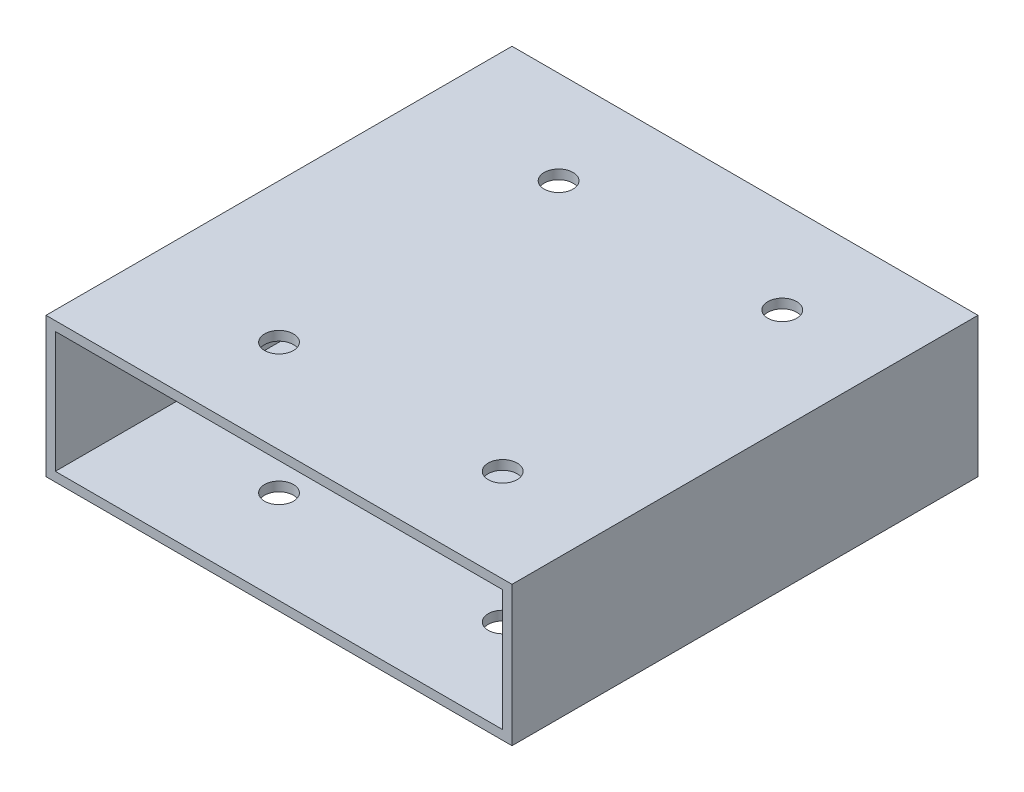
ISO-10303-21;
HEADER;
FILE_DESCRIPTION(('STEP AP214'),'2;1');
FILE_NAME('part.step','',(''),(''),'','','');
FILE_SCHEMA(('AUTOMOTIVE_DESIGN { 1 0 10303 214 1 1 1 1 }'));
ENDSEC;
DATA;
#1=APPLICATION_CONTEXT('core data for automotive mechanical design processes');
#2=APPLICATION_PROTOCOL_DEFINITION('international standard','automotive_design',2000,#1);
#3=PRODUCT_CONTEXT('',#1,'mechanical');
#4=PRODUCT('Part','Part','',(#3));
#5=PRODUCT_RELATED_PRODUCT_CATEGORY('part','',(#4));
#6=PRODUCT_DEFINITION_FORMATION('','',#4);
#7=PRODUCT_DEFINITION_CONTEXT('part definition',#1,'design');
#8=PRODUCT_DEFINITION('design','',#6,#7);
#9=PRODUCT_DEFINITION_SHAPE('','',#8);
#10=(LENGTH_UNIT() NAMED_UNIT(*) SI_UNIT(.MILLI.,.METRE.));
#11=(NAMED_UNIT(*) PLANE_ANGLE_UNIT() SI_UNIT($,.RADIAN.));
#12=(NAMED_UNIT(*) SI_UNIT($,.STERADIAN.) SOLID_ANGLE_UNIT());
#13=UNCERTAINTY_MEASURE_WITH_UNIT(LENGTH_MEASURE(1.E-05),#10,'distance_accuracy_value','');
#14=(GEOMETRIC_REPRESENTATION_CONTEXT(3) GLOBAL_UNCERTAINTY_ASSIGNED_CONTEXT((#13)) GLOBAL_UNIT_ASSIGNED_CONTEXT((#10,
#11,#12)) REPRESENTATION_CONTEXT('',''));
#15=CARTESIAN_POINT('',(0.,0.,0.));
#16=DIRECTION('',(0.,0.,1.));
#17=DIRECTION('',(1.,0.,0.));
#18=AXIS2_PLACEMENT_3D('',#15,#16,#17);
#19=CARTESIAN_POINT('',(0.,0.,50.));
#20=DIRECTION('',(0.,0.,-1.));
#21=DIRECTION('',(-1.,0.,0.));
#22=AXIS2_PLACEMENT_3D('',#19,#20,#21);
#23=PLANE('',#22);
#24=DIRECTION('',(0.,-1.,0.));
#25=VECTOR('',#24,1.);
#26=CARTESIAN_POINT('',(0.,0.,50.));
#27=LINE('',#26,#25);
#28=CARTESIAN_POINT('',(0.,15.,50.));
#29=VERTEX_POINT('',#28);
#30=CARTESIAN_POINT('',(0.,0.,50.));
#31=VERTEX_POINT('',#30);
#32=EDGE_CURVE('E159',#29,#31,#27,.T.);
#33=ORIENTED_EDGE('',*,*,#32,.T.);
#34=DIRECTION('',(1.,0.,0.));
#35=VECTOR('',#34,1.);
#36=CARTESIAN_POINT('',(0.,0.,50.));
#37=LINE('',#36,#35);
#38=CARTESIAN_POINT('',(50.,0.,50.));
#39=VERTEX_POINT('',#38);
#40=EDGE_CURVE('E163',#31,#39,#37,.T.);
#41=ORIENTED_EDGE('',*,*,#40,.T.);
#42=DIRECTION('',(0.,1.,0.));
#43=VECTOR('',#42,1.);
#44=CARTESIAN_POINT('',(50.,0.,50.));
#45=LINE('',#44,#43);
#46=CARTESIAN_POINT('',(50.,15.,50.));
#47=VERTEX_POINT('',#46);
#48=EDGE_CURVE('E167',#39,#47,#45,.T.);
#49=ORIENTED_EDGE('',*,*,#48,.T.);
#50=DIRECTION('',(-1.,0.,0.));
#51=VECTOR('',#50,1.);
#52=CARTESIAN_POINT('',(0.,15.,50.));
#53=LINE('',#52,#51);
#54=EDGE_CURVE('E170',#47,#29,#53,.T.);
#55=ORIENTED_EDGE('',*,*,#54,.T.);
#56=EDGE_LOOP('',(#33,#41,#49,#55));
#57=FACE_BOUND('',#56,.T.);
#58=DIRECTION('',(0.,-1.,0.));
#59=VECTOR('',#58,1.);
#60=CARTESIAN_POINT('',(1.,1.,50.));
#61=LINE('',#60,#59);
#62=CARTESIAN_POINT('',(1.,14.,50.));
#63=VERTEX_POINT('',#62);
#64=CARTESIAN_POINT('',(1.,1.,50.));
#65=VERTEX_POINT('',#64);
#66=EDGE_CURVE('E107',#63,#65,#61,.T.);
#67=ORIENTED_EDGE('',*,*,#66,.F.);
#68=DIRECTION('',(-1.,0.,0.));
#69=VECTOR('',#68,1.);
#70=CARTESIAN_POINT('',(1.,14.,50.));
#71=LINE('',#70,#69);
#72=CARTESIAN_POINT('',(49.,14.,50.));
#73=VERTEX_POINT('',#72);
#74=EDGE_CURVE('E135',#73,#63,#71,.T.);
#75=ORIENTED_EDGE('',*,*,#74,.F.);
#76=DIRECTION('',(0.,1.,0.));
#77=VECTOR('',#76,1.);
#78=CARTESIAN_POINT('',(49.,1.,50.));
#79=LINE('',#78,#77);
#80=CARTESIAN_POINT('',(49.,1.,50.));
#81=VERTEX_POINT('',#80);
#82=EDGE_CURVE('E129',#81,#73,#79,.T.);
#83=ORIENTED_EDGE('',*,*,#82,.F.);
#84=DIRECTION('',(1.,0.,0.));
#85=VECTOR('',#84,1.);
#86=CARTESIAN_POINT('',(1.,1.,50.));
#87=LINE('',#86,#85);
#88=EDGE_CURVE('E116',#65,#81,#87,.T.);
#89=ORIENTED_EDGE('',*,*,#88,.F.);
#90=EDGE_LOOP('',(#67,#75,#83,#89));
#91=FACE_BOUND('',#90,.T.);
#92=ADVANCED_FACE('F39',(#57,#91),#23,.F.);
#93=CARTESIAN_POINT('',(0.,0.,0.));
#94=DIRECTION('',(0.,0.,-1.));
#95=DIRECTION('',(-1.,0.,0.));
#96=AXIS2_PLACEMENT_3D('',#93,#94,#95);
#97=PLANE('',#96);
#98=DIRECTION('',(0.,-1.,0.));
#99=VECTOR('',#98,1.);
#100=CARTESIAN_POINT('',(0.,0.,0.));
#101=LINE('',#100,#99);
#102=CARTESIAN_POINT('',(0.,15.,0.));
#103=VERTEX_POINT('',#102);
#104=CARTESIAN_POINT('',(0.,0.,0.));
#105=VERTEX_POINT('',#104);
#106=EDGE_CURVE('E125',#103,#105,#101,.T.);
#107=ORIENTED_EDGE('',*,*,#106,.F.);
#108=DIRECTION('',(-1.,0.,0.));
#109=VECTOR('',#108,1.);
#110=CARTESIAN_POINT('',(0.,15.,0.));
#111=LINE('',#110,#109);
#112=CARTESIAN_POINT('',(50.,15.,0.));
#113=VERTEX_POINT('',#112);
#114=EDGE_CURVE('E164',#113,#103,#111,.T.);
#115=ORIENTED_EDGE('',*,*,#114,.F.);
#116=DIRECTION('',(0.,1.,0.));
#117=VECTOR('',#116,1.);
#118=CARTESIAN_POINT('',(50.,0.,0.));
#119=LINE('',#118,#117);
#120=CARTESIAN_POINT('',(50.,0.,0.));
#121=VERTEX_POINT('',#120);
#122=EDGE_CURVE('E180',#121,#113,#119,.T.);
#123=ORIENTED_EDGE('',*,*,#122,.F.);
#124=DIRECTION('',(1.,0.,0.));
#125=VECTOR('',#124,1.);
#126=CARTESIAN_POINT('',(0.,0.,0.));
#127=LINE('',#126,#125);
#128=EDGE_CURVE('E177',#105,#121,#127,.T.);
#129=ORIENTED_EDGE('',*,*,#128,.F.);
#130=EDGE_LOOP('',(#107,#115,#123,#129));
#131=FACE_BOUND('',#130,.T.);
#132=DIRECTION('',(-1.,0.,0.));
#133=VECTOR('',#132,1.);
#134=CARTESIAN_POINT('',(1.,14.,0.));
#135=LINE('',#134,#133);
#136=CARTESIAN_POINT('',(49.,14.,0.));
#137=VERTEX_POINT('',#136);
#138=CARTESIAN_POINT('',(1.,14.,0.));
#139=VERTEX_POINT('',#138);
#140=EDGE_CURVE('E117',#137,#139,#135,.T.);
#141=ORIENTED_EDGE('',*,*,#140,.T.);
#142=DIRECTION('',(0.,-1.,0.));
#143=VECTOR('',#142,1.);
#144=CARTESIAN_POINT('',(1.,1.,0.));
#145=LINE('',#144,#143);
#146=CARTESIAN_POINT('',(1.,1.,0.));
#147=VERTEX_POINT('',#146);
#148=EDGE_CURVE('E65',#139,#147,#145,.T.);
#149=ORIENTED_EDGE('',*,*,#148,.T.);
#150=DIRECTION('',(1.,0.,0.));
#151=VECTOR('',#150,1.);
#152=CARTESIAN_POINT('',(1.,1.,0.));
#153=LINE('',#152,#151);
#154=CARTESIAN_POINT('',(49.,1.,0.));
#155=VERTEX_POINT('',#154);
#156=EDGE_CURVE('E123',#147,#155,#153,.T.);
#157=ORIENTED_EDGE('',*,*,#156,.T.);
#158=DIRECTION('',(0.,1.,0.));
#159=VECTOR('',#158,1.);
#160=CARTESIAN_POINT('',(49.,1.,0.));
#161=LINE('',#160,#159);
#162=EDGE_CURVE('E146',#155,#137,#161,.T.);
#163=ORIENTED_EDGE('',*,*,#162,.T.);
#164=EDGE_LOOP('',(#141,#149,#157,#163));
#165=FACE_BOUND('',#164,.T.);
#166=ADVANCED_FACE('F244',(#131,#165),#97,.T.);
#167=CARTESIAN_POINT('',(0.,0.,50.));
#168=DIRECTION('',(1.,0.,0.));
#169=DIRECTION('',(0.,0.,-1.));
#170=AXIS2_PLACEMENT_3D('',#167,#168,#169);
#171=PLANE('',#170);
#172=ORIENTED_EDGE('',*,*,#106,.T.);
#173=DIRECTION('',(0.,0.,-1.));
#174=VECTOR('',#173,1.);
#175=CARTESIAN_POINT('',(0.,0.,50.));
#176=LINE('',#175,#174);
#177=EDGE_CURVE('E11',#31,#105,#176,.T.);
#178=ORIENTED_EDGE('',*,*,#177,.F.);
#179=ORIENTED_EDGE('',*,*,#32,.F.);
#180=DIRECTION('',(0.,0.,-1.));
#181=VECTOR('',#180,1.);
#182=CARTESIAN_POINT('',(0.,15.,50.));
#183=LINE('',#182,#181);
#184=EDGE_CURVE('E173',#29,#103,#183,.T.);
#185=ORIENTED_EDGE('',*,*,#184,.T.);
#186=EDGE_LOOP('',(#172,#178,#179,#185));
#187=FACE_BOUND('',#186,.T.);
#188=ADVANCED_FACE('F41',(#187),#171,.F.);
#189=CARTESIAN_POINT('',(0.,0.,50.));
#190=DIRECTION('',(0.,1.,0.));
#191=DIRECTION('',(0.,0.,1.));
#192=AXIS2_PLACEMENT_3D('',#189,#190,#191);
#193=PLANE('',#192);
#194=CARTESIAN_POINT('',(39.000000000002,0.,39.9999999999925));
#195=DIRECTION('',(0.,1.,0.));
#196=DIRECTION('',(0.,0.,1.));
#197=AXIS2_PLACEMENT_3D('',#194,#195,#196);
#198=CIRCLE('',#197,1.55000000000125);
#199=CARTESIAN_POINT('',(39.000000000002,0.,41.5499999999937));
#200=VERTEX_POINT('',#199);
#201=EDGE_CURVE('E280',#200,#200,#198,.T.);
#202=ORIENTED_EDGE('',*,*,#201,.T.);
#203=EDGE_LOOP('',(#202));
#204=FACE_BOUND('',#203,.T.);
#205=CARTESIAN_POINT('',(15.000000000002,0.,39.9999999999925));
#206=DIRECTION('',(0.,1.,0.));
#207=DIRECTION('',(0.,0.,1.));
#208=AXIS2_PLACEMENT_3D('',#205,#206,#207);
#209=CIRCLE('',#208,1.55000000000126);
#210=CARTESIAN_POINT('',(15.000000000002,0.,41.5499999999937));
#211=VERTEX_POINT('',#210);
#212=EDGE_CURVE('E284',#211,#211,#209,.T.);
#213=ORIENTED_EDGE('',*,*,#212,.T.);
#214=EDGE_LOOP('',(#213));
#215=FACE_BOUND('',#214,.T.);
#216=CARTESIAN_POINT('',(15.000000000002,0.,9.99999999999248));
#217=DIRECTION('',(0.,1.,0.));
#218=DIRECTION('',(0.,0.,1.));
#219=AXIS2_PLACEMENT_3D('',#216,#217,#218);
#220=CIRCLE('',#219,1.55000000000126);
#221=CARTESIAN_POINT('',(15.000000000002,0.,11.5499999999937));
#222=VERTEX_POINT('',#221);
#223=EDGE_CURVE('E288',#222,#222,#220,.T.);
#224=ORIENTED_EDGE('',*,*,#223,.T.);
#225=EDGE_LOOP('',(#224));
#226=FACE_BOUND('',#225,.T.);
#227=CARTESIAN_POINT('',(39.000000000002,0.,9.99999999999247));
#228=DIRECTION('',(0.,1.,0.));
#229=DIRECTION('',(0.,0.,1.));
#230=AXIS2_PLACEMENT_3D('',#227,#228,#229);
#231=CIRCLE('',#230,1.55000000000127);
#232=CARTESIAN_POINT('',(39.000000000002,0.,11.5499999999937));
#233=VERTEX_POINT('',#232);
#234=EDGE_CURVE('E199',#233,#233,#231,.T.);
#235=ORIENTED_EDGE('',*,*,#234,.T.);
#236=EDGE_LOOP('',(#235));
#237=FACE_BOUND('',#236,.T.);
#238=ORIENTED_EDGE('',*,*,#128,.T.);
#239=DIRECTION('',(0.,0.,-1.));
#240=VECTOR('',#239,1.);
#241=CARTESIAN_POINT('',(50.,0.,50.));
#242=LINE('',#241,#240);
#243=EDGE_CURVE('E49',#39,#121,#242,.T.);
#244=ORIENTED_EDGE('',*,*,#243,.F.);
#245=ORIENTED_EDGE('',*,*,#40,.F.);
#246=ORIENTED_EDGE('',*,*,#177,.T.);
#247=EDGE_LOOP('',(#238,#244,#245,#246));
#248=FACE_BOUND('',#247,.T.);
#249=ADVANCED_FACE('F269',(#204,#215,#226,#237,#248),#193,.F.);
#250=CARTESIAN_POINT('',(50.,0.,50.));
#251=DIRECTION('',(-1.,0.,0.));
#252=DIRECTION('',(0.,0.,1.));
#253=AXIS2_PLACEMENT_3D('',#250,#251,#252);
#254=PLANE('',#253);
#255=ORIENTED_EDGE('',*,*,#122,.T.);
#256=DIRECTION('',(0.,0.,-1.));
#257=VECTOR('',#256,1.);
#258=CARTESIAN_POINT('',(50.,15.,50.));
#259=LINE('',#258,#257);
#260=EDGE_CURVE('E187',#47,#113,#259,.T.);
#261=ORIENTED_EDGE('',*,*,#260,.F.);
#262=ORIENTED_EDGE('',*,*,#48,.F.);
#263=ORIENTED_EDGE('',*,*,#243,.T.);
#264=EDGE_LOOP('',(#255,#261,#262,#263));
#265=FACE_BOUND('',#264,.T.);
#266=ADVANCED_FACE('F266',(#265),#254,.F.);
#267=CARTESIAN_POINT('',(0.,15.,50.));
#268=DIRECTION('',(0.,-1.,0.));
#269=DIRECTION('',(0.,0.,-1.));
#270=AXIS2_PLACEMENT_3D('',#267,#268,#269);
#271=PLANE('',#270);
#272=CARTESIAN_POINT('',(39.000000000002,15.,39.9999999999925));
#273=DIRECTION('',(0.,1.,0.));
#274=DIRECTION('',(0.,0.,1.));
#275=AXIS2_PLACEMENT_3D('',#272,#273,#274);
#276=CIRCLE('',#275,1.55000000000125);
#277=CARTESIAN_POINT('',(39.000000000002,15.,41.5499999999937));
#278=VERTEX_POINT('',#277);
#279=EDGE_CURVE('E310',#278,#278,#276,.T.);
#280=ORIENTED_EDGE('',*,*,#279,.F.);
#281=EDGE_LOOP('',(#280));
#282=FACE_BOUND('',#281,.T.);
#283=CARTESIAN_POINT('',(15.000000000002,15.,39.9999999999925));
#284=DIRECTION('',(0.,1.,0.));
#285=DIRECTION('',(0.,0.,1.));
#286=AXIS2_PLACEMENT_3D('',#283,#284,#285);
#287=CIRCLE('',#286,1.55000000000126);
#288=CARTESIAN_POINT('',(15.000000000002,15.,41.5499999999937));
#289=VERTEX_POINT('',#288);
#290=EDGE_CURVE('E314',#289,#289,#287,.T.);
#291=ORIENTED_EDGE('',*,*,#290,.F.);
#292=EDGE_LOOP('',(#291));
#293=FACE_BOUND('',#292,.T.);
#294=CARTESIAN_POINT('',(15.000000000002,15.,9.99999999999248));
#295=DIRECTION('',(0.,1.,0.));
#296=DIRECTION('',(0.,0.,1.));
#297=AXIS2_PLACEMENT_3D('',#294,#295,#296);
#298=CIRCLE('',#297,1.55000000000126);
#299=CARTESIAN_POINT('',(15.000000000002,15.,11.5499999999937));
#300=VERTEX_POINT('',#299);
#301=EDGE_CURVE('E320',#300,#300,#298,.T.);
#302=ORIENTED_EDGE('',*,*,#301,.F.);
#303=EDGE_LOOP('',(#302));
#304=FACE_BOUND('',#303,.T.);
#305=CARTESIAN_POINT('',(39.000000000002,15.,9.99999999999247));
#306=DIRECTION('',(0.,1.,0.));
#307=DIRECTION('',(0.,0.,1.));
#308=AXIS2_PLACEMENT_3D('',#305,#306,#307);
#309=CIRCLE('',#308,1.55000000000127);
#310=CARTESIAN_POINT('',(39.000000000002,15.,11.5499999999937));
#311=VERTEX_POINT('',#310);
#312=EDGE_CURVE('E305',#311,#311,#309,.T.);
#313=ORIENTED_EDGE('',*,*,#312,.F.);
#314=EDGE_LOOP('',(#313));
#315=FACE_BOUND('',#314,.T.);
#316=ORIENTED_EDGE('',*,*,#114,.T.);
#317=ORIENTED_EDGE('',*,*,#184,.F.);
#318=ORIENTED_EDGE('',*,*,#54,.F.);
#319=ORIENTED_EDGE('',*,*,#260,.T.);
#320=EDGE_LOOP('',(#316,#317,#318,#319));
#321=FACE_BOUND('',#320,.T.);
#322=ADVANCED_FACE('F263',(#282,#293,#304,#315,#321),#271,.F.);
#323=CARTESIAN_POINT('',(1.,1.,50.));
#324=DIRECTION('',(1.,0.,0.));
#325=DIRECTION('',(0.,0.,-1.));
#326=AXIS2_PLACEMENT_3D('',#323,#324,#325);
#327=PLANE('',#326);
#328=ORIENTED_EDGE('',*,*,#148,.F.);
#329=DIRECTION('',(0.,0.,-1.));
#330=VECTOR('',#329,1.);
#331=CARTESIAN_POINT('',(1.,14.,50.));
#332=LINE('',#331,#330);
#333=EDGE_CURVE('E111',#63,#139,#332,.T.);
#334=ORIENTED_EDGE('',*,*,#333,.F.);
#335=ORIENTED_EDGE('',*,*,#66,.T.);
#336=DIRECTION('',(0.,0.,-1.));
#337=VECTOR('',#336,1.);
#338=CARTESIAN_POINT('',(1.,1.,50.));
#339=LINE('',#338,#337);
#340=EDGE_CURVE('E110',#65,#147,#339,.T.);
#341=ORIENTED_EDGE('',*,*,#340,.T.);
#342=EDGE_LOOP('',(#328,#334,#335,#341));
#343=FACE_BOUND('',#342,.T.);
#344=ADVANCED_FACE('F109',(#343),#327,.T.);
#345=CARTESIAN_POINT('',(1.,1.,50.));
#346=DIRECTION('',(0.,1.,0.));
#347=DIRECTION('',(0.,0.,1.));
#348=AXIS2_PLACEMENT_3D('',#345,#346,#347);
#349=PLANE('',#348);
#350=CARTESIAN_POINT('',(39.000000000002,1.,39.9999999999925));
#351=DIRECTION('',(0.,1.,0.));
#352=DIRECTION('',(0.,0.,1.));
#353=AXIS2_PLACEMENT_3D('',#350,#351,#352);
#354=CIRCLE('',#353,1.55000000000125);
#355=CARTESIAN_POINT('',(39.000000000002,1.,41.5499999999937));
#356=VERTEX_POINT('',#355);
#357=EDGE_CURVE('E143',#356,#356,#354,.T.);
#358=ORIENTED_EDGE('',*,*,#357,.F.);
#359=EDGE_LOOP('',(#358));
#360=FACE_BOUND('',#359,.T.);
#361=CARTESIAN_POINT('',(15.000000000002,1.,39.9999999999925));
#362=DIRECTION('',(0.,1.,0.));
#363=DIRECTION('',(0.,0.,1.));
#364=AXIS2_PLACEMENT_3D('',#361,#362,#363);
#365=CIRCLE('',#364,1.55000000000126);
#366=CARTESIAN_POINT('',(15.000000000002,1.,41.5499999999937));
#367=VERTEX_POINT('',#366);
#368=EDGE_CURVE('E207',#367,#367,#365,.T.);
#369=ORIENTED_EDGE('',*,*,#368,.F.);
#370=EDGE_LOOP('',(#369));
#371=FACE_BOUND('',#370,.T.);
#372=CARTESIAN_POINT('',(15.000000000002,1.,9.99999999999248));
#373=DIRECTION('',(0.,1.,0.));
#374=DIRECTION('',(0.,0.,1.));
#375=AXIS2_PLACEMENT_3D('',#372,#373,#374);
#376=CIRCLE('',#375,1.55000000000126);
#377=CARTESIAN_POINT('',(15.000000000002,1.,11.5499999999937));
#378=VERTEX_POINT('',#377);
#379=EDGE_CURVE('E203',#378,#378,#376,.T.);
#380=ORIENTED_EDGE('',*,*,#379,.F.);
#381=EDGE_LOOP('',(#380));
#382=FACE_BOUND('',#381,.T.);
#383=CARTESIAN_POINT('',(39.000000000002,1.,9.99999999999247));
#384=DIRECTION('',(0.,1.,0.));
#385=DIRECTION('',(0.,0.,1.));
#386=AXIS2_PLACEMENT_3D('',#383,#384,#385);
#387=CIRCLE('',#386,1.55000000000127);
#388=CARTESIAN_POINT('',(39.000000000002,1.,11.5499999999937));
#389=VERTEX_POINT('',#388);
#390=EDGE_CURVE('E198',#389,#389,#387,.T.);
#391=ORIENTED_EDGE('',*,*,#390,.F.);
#392=EDGE_LOOP('',(#391));
#393=FACE_BOUND('',#392,.T.);
#394=ORIENTED_EDGE('',*,*,#156,.F.);
#395=ORIENTED_EDGE('',*,*,#340,.F.);
#396=ORIENTED_EDGE('',*,*,#88,.T.);
#397=DIRECTION('',(0.,0.,-1.));
#398=VECTOR('',#397,1.);
#399=CARTESIAN_POINT('',(49.,1.,50.));
#400=LINE('',#399,#398);
#401=EDGE_CURVE('E126',#81,#155,#400,.T.);
#402=ORIENTED_EDGE('',*,*,#401,.T.);
#403=EDGE_LOOP('',(#394,#395,#396,#402));
#404=FACE_BOUND('',#403,.T.);
#405=ADVANCED_FACE('F120',(#360,#371,#382,#393,#404),#349,.T.);
#406=CARTESIAN_POINT('',(49.,1.,50.));
#407=DIRECTION('',(-1.,0.,0.));
#408=DIRECTION('',(0.,0.,1.));
#409=AXIS2_PLACEMENT_3D('',#406,#407,#408);
#410=PLANE('',#409);
#411=ORIENTED_EDGE('',*,*,#162,.F.);
#412=ORIENTED_EDGE('',*,*,#401,.F.);
#413=ORIENTED_EDGE('',*,*,#82,.T.);
#414=DIRECTION('',(0.,0.,-1.));
#415=VECTOR('',#414,1.);
#416=CARTESIAN_POINT('',(49.,14.,50.));
#417=LINE('',#416,#415);
#418=EDGE_CURVE('E57',#73,#137,#417,.T.);
#419=ORIENTED_EDGE('',*,*,#418,.T.);
#420=EDGE_LOOP('',(#411,#412,#413,#419));
#421=FACE_BOUND('',#420,.T.);
#422=ADVANCED_FACE('F236',(#421),#410,.T.);
#423=CARTESIAN_POINT('',(1.,14.,50.));
#424=DIRECTION('',(0.,-1.,0.));
#425=DIRECTION('',(0.,0.,-1.));
#426=AXIS2_PLACEMENT_3D('',#423,#424,#425);
#427=PLANE('',#426);
#428=CARTESIAN_POINT('',(39.000000000002,14.,39.9999999999925));
#429=DIRECTION('',(0.,-1.,0.));
#430=DIRECTION('',(0.,0.,-1.));
#431=AXIS2_PLACEMENT_3D('',#428,#429,#430);
#432=CIRCLE('',#431,1.55000000000125);
#433=CARTESIAN_POINT('',(39.000000000002,14.,38.4499999999912));
#434=VERTEX_POINT('',#433);
#435=EDGE_CURVE('E43',#434,#434,#432,.T.);
#436=ORIENTED_EDGE('',*,*,#435,.F.);
#437=EDGE_LOOP('',(#436));
#438=FACE_BOUND('',#437,.T.);
#439=CARTESIAN_POINT('',(15.000000000002,14.,39.9999999999925));
#440=DIRECTION('',(0.,-1.,0.));
#441=DIRECTION('',(0.,0.,-1.));
#442=AXIS2_PLACEMENT_3D('',#439,#440,#441);
#443=CIRCLE('',#442,1.55000000000126);
#444=CARTESIAN_POINT('',(15.000000000002,14.,38.4499999999912));
#445=VERTEX_POINT('',#444);
#446=EDGE_CURVE('E204',#445,#445,#443,.T.);
#447=ORIENTED_EDGE('',*,*,#446,.F.);
#448=EDGE_LOOP('',(#447));
#449=FACE_BOUND('',#448,.T.);
#450=CARTESIAN_POINT('',(15.000000000002,14.,9.99999999999248));
#451=DIRECTION('',(0.,-1.,0.));
#452=DIRECTION('',(0.,0.,-1.));
#453=AXIS2_PLACEMENT_3D('',#450,#451,#452);
#454=CIRCLE('',#453,1.55000000000126);
#455=CARTESIAN_POINT('',(15.000000000002,14.,8.44999999999122));
#456=VERTEX_POINT('',#455);
#457=EDGE_CURVE('E200',#456,#456,#454,.T.);
#458=ORIENTED_EDGE('',*,*,#457,.F.);
#459=EDGE_LOOP('',(#458));
#460=FACE_BOUND('',#459,.T.);
#461=CARTESIAN_POINT('',(39.000000000002,14.,9.99999999999247));
#462=DIRECTION('',(0.,-1.,0.));
#463=DIRECTION('',(0.,0.,-1.));
#464=AXIS2_PLACEMENT_3D('',#461,#462,#463);
#465=CIRCLE('',#464,1.55000000000127);
#466=CARTESIAN_POINT('',(39.000000000002,14.,8.44999999999121));
#467=VERTEX_POINT('',#466);
#468=EDGE_CURVE('E194',#467,#467,#465,.T.);
#469=ORIENTED_EDGE('',*,*,#468,.F.);
#470=EDGE_LOOP('',(#469));
#471=FACE_BOUND('',#470,.T.);
#472=ORIENTED_EDGE('',*,*,#140,.F.);
#473=ORIENTED_EDGE('',*,*,#418,.F.);
#474=ORIENTED_EDGE('',*,*,#74,.T.);
#475=ORIENTED_EDGE('',*,*,#333,.T.);
#476=EDGE_LOOP('',(#472,#473,#474,#475));
#477=FACE_BOUND('',#476,.T.);
#478=ADVANCED_FACE('F232',(#438,#449,#460,#471,#477),#427,.T.);
#479=CARTESIAN_POINT('',(39.000000000002,0.,9.99999999999247));
#480=DIRECTION('',(0.,1.,0.));
#481=DIRECTION('',(0.,0.,1.));
#482=AXIS2_PLACEMENT_3D('',#479,#480,#481);
#483=CYLINDRICAL_SURFACE('',#482,1.55000000000127);
#484=ORIENTED_EDGE('',*,*,#468,.T.);
#485=EDGE_LOOP('',(#484));
#486=FACE_BOUND('',#485,.T.);
#487=ORIENTED_EDGE('',*,*,#312,.T.);
#488=EDGE_LOOP('',(#487));
#489=FACE_BOUND('',#488,.T.);
#490=ADVANCED_FACE('F235',(#486,#489),#483,.F.);
#491=CARTESIAN_POINT('',(15.000000000002,0.,9.99999999999248));
#492=DIRECTION('',(0.,1.,0.));
#493=DIRECTION('',(0.,0.,1.));
#494=AXIS2_PLACEMENT_3D('',#491,#492,#493);
#495=CYLINDRICAL_SURFACE('',#494,1.55000000000126);
#496=ORIENTED_EDGE('',*,*,#457,.T.);
#497=EDGE_LOOP('',(#496));
#498=FACE_BOUND('',#497,.T.);
#499=ORIENTED_EDGE('',*,*,#301,.T.);
#500=EDGE_LOOP('',(#499));
#501=FACE_BOUND('',#500,.T.);
#502=ADVANCED_FACE('F327',(#498,#501),#495,.F.);
#503=CARTESIAN_POINT('',(15.000000000002,0.,39.9999999999925));
#504=DIRECTION('',(0.,1.,0.));
#505=DIRECTION('',(0.,0.,1.));
#506=AXIS2_PLACEMENT_3D('',#503,#504,#505);
#507=CYLINDRICAL_SURFACE('',#506,1.55000000000126);
#508=ORIENTED_EDGE('',*,*,#446,.T.);
#509=EDGE_LOOP('',(#508));
#510=FACE_BOUND('',#509,.T.);
#511=ORIENTED_EDGE('',*,*,#290,.T.);
#512=EDGE_LOOP('',(#511));
#513=FACE_BOUND('',#512,.T.);
#514=ADVANCED_FACE('F339',(#510,#513),#507,.F.);
#515=CARTESIAN_POINT('',(39.000000000002,0.,39.9999999999925));
#516=DIRECTION('',(0.,1.,0.));
#517=DIRECTION('',(0.,0.,1.));
#518=AXIS2_PLACEMENT_3D('',#515,#516,#517);
#519=CYLINDRICAL_SURFACE('',#518,1.55000000000125);
#520=ORIENTED_EDGE('',*,*,#435,.T.);
#521=EDGE_LOOP('',(#520));
#522=FACE_BOUND('',#521,.T.);
#523=ORIENTED_EDGE('',*,*,#279,.T.);
#524=EDGE_LOOP('',(#523));
#525=FACE_BOUND('',#524,.T.);
#526=ADVANCED_FACE('F229',(#522,#525),#519,.F.);
#527=ORIENTED_EDGE('',*,*,#390,.T.);
#528=EDGE_LOOP('',(#527));
#529=FACE_BOUND('',#528,.T.);
#530=ORIENTED_EDGE('',*,*,#234,.F.);
#531=EDGE_LOOP('',(#530));
#532=FACE_BOUND('',#531,.T.);
#533=ADVANCED_FACE('F335',(#529,#532),#483,.F.);
#534=ORIENTED_EDGE('',*,*,#379,.T.);
#535=EDGE_LOOP('',(#534));
#536=FACE_BOUND('',#535,.T.);
#537=ORIENTED_EDGE('',*,*,#223,.F.);
#538=EDGE_LOOP('',(#537));
#539=FACE_BOUND('',#538,.T.);
#540=ADVANCED_FACE('F342',(#536,#539),#495,.F.);
#541=ORIENTED_EDGE('',*,*,#368,.T.);
#542=EDGE_LOOP('',(#541));
#543=FACE_BOUND('',#542,.T.);
#544=ORIENTED_EDGE('',*,*,#212,.F.);
#545=EDGE_LOOP('',(#544));
#546=FACE_BOUND('',#545,.T.);
#547=ADVANCED_FACE('F350',(#543,#546),#507,.F.);
#548=ORIENTED_EDGE('',*,*,#357,.T.);
#549=EDGE_LOOP('',(#548));
#550=FACE_BOUND('',#549,.T.);
#551=ORIENTED_EDGE('',*,*,#201,.F.);
#552=EDGE_LOOP('',(#551));
#553=FACE_BOUND('',#552,.T.);
#554=ADVANCED_FACE('F351',(#550,#553),#519,.F.);
#555=CLOSED_SHELL('',(#92,#166,#188,#249,#266,#322,#344,#405,#422,#478,#490,#502,#514,#526,#533,
#540,#547,#554));
#556=MANIFOLD_SOLID_BREP('B2',#555);
#557=ADVANCED_BREP_SHAPE_REPRESENTATION('',(#18,#556),#14);
#558=SHAPE_DEFINITION_REPRESENTATION(#9,#557);
ENDSEC;
END-ISO-10303-21;
